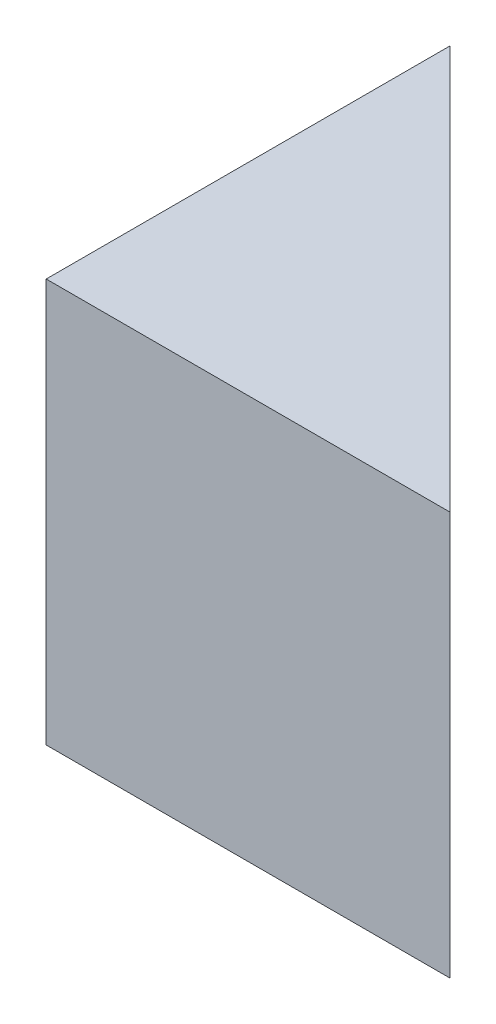
ISO-10303-21;
HEADER;
FILE_DESCRIPTION(('STEP AP214'),'2;1');
FILE_NAME('part.step','',(''),(''),'','','');
FILE_SCHEMA(('AUTOMOTIVE_DESIGN { 1 0 10303 214 1 1 1 1 }'));
ENDSEC;
DATA;
#1=APPLICATION_CONTEXT('core data for automotive mechanical design processes');
#2=APPLICATION_PROTOCOL_DEFINITION('international standard','automotive_design',2000,#1);
#3=PRODUCT_CONTEXT('',#1,'mechanical');
#4=PRODUCT('Part','Part','',(#3));
#5=PRODUCT_RELATED_PRODUCT_CATEGORY('part','',(#4));
#6=PRODUCT_DEFINITION_FORMATION('','',#4);
#7=PRODUCT_DEFINITION_CONTEXT('part definition',#1,'design');
#8=PRODUCT_DEFINITION('design','',#6,#7);
#9=PRODUCT_DEFINITION_SHAPE('','',#8);
#10=(LENGTH_UNIT() NAMED_UNIT(*) SI_UNIT(.MILLI.,.METRE.));
#11=(NAMED_UNIT(*) PLANE_ANGLE_UNIT() SI_UNIT($,.RADIAN.));
#12=(NAMED_UNIT(*) SI_UNIT($,.STERADIAN.) SOLID_ANGLE_UNIT());
#13=UNCERTAINTY_MEASURE_WITH_UNIT(LENGTH_MEASURE(1.E-05),#10,'distance_accuracy_value','');
#14=(GEOMETRIC_REPRESENTATION_CONTEXT(3) GLOBAL_UNCERTAINTY_ASSIGNED_CONTEXT((#13)) GLOBAL_UNIT_ASSIGNED_CONTEXT((#10,
#11,#12)) REPRESENTATION_CONTEXT('',''));
#15=CARTESIAN_POINT('',(0.,0.,0.));
#16=DIRECTION('',(0.,0.,1.));
#17=DIRECTION('',(1.,0.,0.));
#18=AXIS2_PLACEMENT_3D('',#15,#16,#17);
#19=CARTESIAN_POINT('',(0.,30.,-30.));
#20=DIRECTION('',(1.,0.,0.));
#21=DIRECTION('',(0.,0.,-1.));
#22=AXIS2_PLACEMENT_3D('',#19,#20,#21);
#23=PLANE('',#22);
#24=DIRECTION('',(0.,0.,1.));
#25=VECTOR('',#24,1.);
#26=CARTESIAN_POINT('',(0.,0.,-30.));
#27=LINE('',#26,#25);
#28=CARTESIAN_POINT('',(0.,0.,-30.));
#29=VERTEX_POINT('',#28);
#30=CARTESIAN_POINT('',(0.,0.,0.));
#31=VERTEX_POINT('',#30);
#32=EDGE_CURVE('E80',#29,#31,#27,.T.);
#33=ORIENTED_EDGE('',*,*,#32,.T.);
#34=DIRECTION('',(0.,-1.,0.));
#35=VECTOR('',#34,1.);
#36=CARTESIAN_POINT('',(0.,30.,0.));
#37=LINE('',#36,#35);
#38=CARTESIAN_POINT('',(0.,30.,0.));
#39=VERTEX_POINT('',#38);
#40=EDGE_CURVE('E11',#39,#31,#37,.T.);
#41=ORIENTED_EDGE('',*,*,#40,.F.);
#42=DIRECTION('',(0.,0.,1.));
#43=VECTOR('',#42,1.);
#44=CARTESIAN_POINT('',(0.,30.,-30.));
#45=LINE('',#44,#43);
#46=CARTESIAN_POINT('',(0.,30.,-30.));
#47=VERTEX_POINT('',#46);
#48=EDGE_CURVE('E73',#47,#39,#45,.T.);
#49=ORIENTED_EDGE('',*,*,#48,.F.);
#50=DIRECTION('',(0.,-1.,0.));
#51=VECTOR('',#50,1.);
#52=CARTESIAN_POINT('',(0.,30.,-30.));
#53=LINE('',#52,#51);
#54=EDGE_CURVE('E81',#47,#29,#53,.T.);
#55=ORIENTED_EDGE('',*,*,#54,.T.);
#56=EDGE_LOOP('',(#33,#41,#49,#55));
#57=FACE_BOUND('',#56,.T.);
#58=ADVANCED_FACE('F33',(#57),#23,.F.);
#59=CARTESIAN_POINT('',(0.,30.,0.));
#60=DIRECTION('',(0.,0.,-1.));
#61=DIRECTION('',(-1.,0.,0.));
#62=AXIS2_PLACEMENT_3D('',#59,#60,#61);
#63=PLANE('',#62);
#64=DIRECTION('',(1.,0.,0.));
#65=VECTOR('',#64,1.);
#66=CARTESIAN_POINT('',(0.,0.,0.));
#67=LINE('',#66,#65);
#68=CARTESIAN_POINT('',(30.,0.,0.));
#69=VERTEX_POINT('',#68);
#70=EDGE_CURVE('E61',#31,#69,#67,.T.);
#71=ORIENTED_EDGE('',*,*,#70,.T.);
#72=DIRECTION('',(0.,-1.,0.));
#73=VECTOR('',#72,1.);
#74=CARTESIAN_POINT('',(30.,30.,0.));
#75=LINE('',#74,#73);
#76=CARTESIAN_POINT('',(30.,30.,0.));
#77=VERTEX_POINT('',#76);
#78=EDGE_CURVE('E41',#77,#69,#75,.T.);
#79=ORIENTED_EDGE('',*,*,#78,.F.);
#80=DIRECTION('',(1.,0.,0.));
#81=VECTOR('',#80,1.);
#82=CARTESIAN_POINT('',(0.,30.,0.));
#83=LINE('',#82,#81);
#84=EDGE_CURVE('E69',#39,#77,#83,.T.);
#85=ORIENTED_EDGE('',*,*,#84,.F.);
#86=ORIENTED_EDGE('',*,*,#40,.T.);
#87=EDGE_LOOP('',(#71,#79,#85,#86));
#88=FACE_BOUND('',#87,.T.);
#89=ADVANCED_FACE('F70',(#88),#63,.F.);
#90=CARTESIAN_POINT('',(30.,30.,0.));
#91=DIRECTION('',(-0.707106781186547,0.,0.707106781186547));
#92=DIRECTION('',(0.707106781186548,0.,0.707106781186548));
#93=AXIS2_PLACEMENT_3D('',#90,#91,#92);
#94=PLANE('',#93);
#95=DIRECTION('',(-0.707106781186547,0.,-0.707106781186547));
#96=VECTOR('',#95,1.);
#97=CARTESIAN_POINT('',(30.,0.,0.));
#98=LINE('',#97,#96);
#99=EDGE_CURVE('E66',#69,#29,#98,.T.);
#100=ORIENTED_EDGE('',*,*,#99,.T.);
#101=ORIENTED_EDGE('',*,*,#54,.F.);
#102=DIRECTION('',(-0.707106781186547,0.,-0.707106781186547));
#103=VECTOR('',#102,1.);
#104=CARTESIAN_POINT('',(30.,30.,0.));
#105=LINE('',#104,#103);
#106=EDGE_CURVE('E49',#77,#47,#105,.T.);
#107=ORIENTED_EDGE('',*,*,#106,.F.);
#108=ORIENTED_EDGE('',*,*,#78,.T.);
#109=EDGE_LOOP('',(#100,#101,#107,#108));
#110=FACE_BOUND('',#109,.T.);
#111=ADVANCED_FACE('F88',(#110),#94,.F.);
#112=CARTESIAN_POINT('',(0.,30.,0.));
#113=DIRECTION('',(0.,1.,0.));
#114=DIRECTION('',(0.,0.,1.));
#115=AXIS2_PLACEMENT_3D('',#112,#113,#114);
#116=PLANE('',#115);
#117=ORIENTED_EDGE('',*,*,#48,.T.);
#118=ORIENTED_EDGE('',*,*,#84,.T.);
#119=ORIENTED_EDGE('',*,*,#106,.T.);
#120=EDGE_LOOP('',(#117,#118,#119));
#121=FACE_BOUND('',#120,.T.);
#122=ADVANCED_FACE('F76',(#121),#116,.T.);
#123=CARTESIAN_POINT('',(0.,0.,0.));
#124=DIRECTION('',(0.,1.,0.));
#125=DIRECTION('',(0.,0.,1.));
#126=AXIS2_PLACEMENT_3D('',#123,#124,#125);
#127=PLANE('',#126);
#128=ORIENTED_EDGE('',*,*,#32,.F.);
#129=ORIENTED_EDGE('',*,*,#99,.F.);
#130=ORIENTED_EDGE('',*,*,#70,.F.);
#131=EDGE_LOOP('',(#128,#129,#130));
#132=FACE_BOUND('',#131,.T.);
#133=ADVANCED_FACE('F89',(#132),#127,.F.);
#134=CLOSED_SHELL('',(#58,#89,#111,#122,#133));
#135=MANIFOLD_SOLID_BREP('B2',#134);
#136=ADVANCED_BREP_SHAPE_REPRESENTATION('',(#18,#135),#14);
#137=SHAPE_DEFINITION_REPRESENTATION(#9,#136);
ENDSEC;
END-ISO-10303-21;
